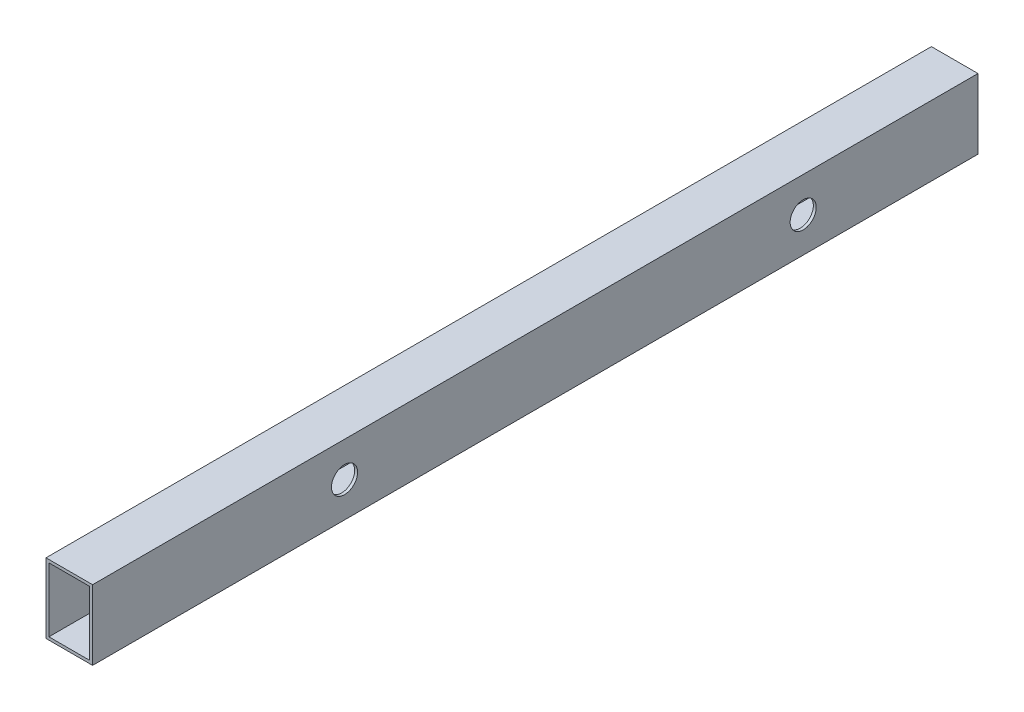
ISO-10303-21;
HEADER;
FILE_DESCRIPTION(('STEP AP214'),'2;1');
FILE_NAME('part.step','',(''),(''),'','','');
FILE_SCHEMA(('AUTOMOTIVE_DESIGN { 1 0 10303 214 1 1 1 1 }'));
ENDSEC;
DATA;
#1=APPLICATION_CONTEXT('core data for automotive mechanical design processes');
#2=APPLICATION_PROTOCOL_DEFINITION('international standard','automotive_design',2000,#1);
#3=PRODUCT_CONTEXT('',#1,'mechanical');
#4=PRODUCT('Part','Part','',(#3));
#5=PRODUCT_RELATED_PRODUCT_CATEGORY('part','',(#4));
#6=PRODUCT_DEFINITION_FORMATION('','',#4);
#7=PRODUCT_DEFINITION_CONTEXT('part definition',#1,'design');
#8=PRODUCT_DEFINITION('design','',#6,#7);
#9=PRODUCT_DEFINITION_SHAPE('','',#8);
#10=(LENGTH_UNIT() NAMED_UNIT(*) SI_UNIT(.MILLI.,.METRE.));
#11=(NAMED_UNIT(*) PLANE_ANGLE_UNIT() SI_UNIT($,.RADIAN.));
#12=(NAMED_UNIT(*) SI_UNIT($,.STERADIAN.) SOLID_ANGLE_UNIT());
#13=UNCERTAINTY_MEASURE_WITH_UNIT(LENGTH_MEASURE(1.E-05),#10,'distance_accuracy_value','');
#14=(GEOMETRIC_REPRESENTATION_CONTEXT(3) GLOBAL_UNCERTAINTY_ASSIGNED_CONTEXT((#13)) GLOBAL_UNIT_ASSIGNED_CONTEXT((#10,
#11,#12)) REPRESENTATION_CONTEXT('',''));
#15=CARTESIAN_POINT('',(0.,0.,0.));
#16=DIRECTION('',(0.,0.,1.));
#17=DIRECTION('',(1.,0.,0.));
#18=AXIS2_PLACEMENT_3D('',#15,#16,#17);
#19=CARTESIAN_POINT('',(0.,0.,965.2));
#20=DIRECTION('',(0.,0.,1.));
#21=DIRECTION('',(1.,0.,0.));
#22=AXIS2_PLACEMENT_3D('',#19,#20,#21);
#23=PLANE('',#22);
#24=DIRECTION('',(0.,1.,0.));
#25=VECTOR('',#24,1.);
#26=CARTESIAN_POINT('',(25.4,38.1,965.2));
#27=LINE('',#26,#25);
#28=CARTESIAN_POINT('',(25.4,-38.1,965.2));
#29=VERTEX_POINT('',#28);
#30=CARTESIAN_POINT('',(25.4,38.1,965.2));
#31=VERTEX_POINT('',#30);
#32=EDGE_CURVE('E156',#29,#31,#27,.T.);
#33=ORIENTED_EDGE('',*,*,#32,.T.);
#34=DIRECTION('',(-1.,0.,0.));
#35=VECTOR('',#34,1.);
#36=CARTESIAN_POINT('',(-25.4,38.1,965.2));
#37=LINE('',#36,#35);
#38=CARTESIAN_POINT('',(-25.4,38.1,965.2));
#39=VERTEX_POINT('',#38);
#40=EDGE_CURVE('E160',#31,#39,#37,.T.);
#41=ORIENTED_EDGE('',*,*,#40,.T.);
#42=DIRECTION('',(0.,-1.,0.));
#43=VECTOR('',#42,1.);
#44=CARTESIAN_POINT('',(-25.4,38.1,965.2));
#45=LINE('',#44,#43);
#46=CARTESIAN_POINT('',(-25.3999999999999,-38.1,965.2));
#47=VERTEX_POINT('',#46);
#48=EDGE_CURVE('E164',#39,#47,#45,.T.);
#49=ORIENTED_EDGE('',*,*,#48,.T.);
#50=DIRECTION('',(1.,0.,0.));
#51=VECTOR('',#50,1.);
#52=CARTESIAN_POINT('',(-25.3999999999999,-38.1,965.2));
#53=LINE('',#52,#51);
#54=EDGE_CURVE('E167',#47,#29,#53,.T.);
#55=ORIENTED_EDGE('',*,*,#54,.T.);
#56=EDGE_LOOP('',(#33,#41,#49,#55));
#57=FACE_BOUND('',#56,.T.);
#58=DIRECTION('',(1.,0.,0.));
#59=VECTOR('',#58,1.);
#60=CARTESIAN_POINT('',(-22.225,-34.925,965.2));
#61=LINE('',#60,#59);
#62=CARTESIAN_POINT('',(-22.225,-34.925,965.2));
#63=VERTEX_POINT('',#62);
#64=CARTESIAN_POINT('',(22.225,-34.925,965.2));
#65=VERTEX_POINT('',#64);
#66=EDGE_CURVE('E115',#63,#65,#61,.T.);
#67=ORIENTED_EDGE('',*,*,#66,.F.);
#68=DIRECTION('',(0.,-1.,0.));
#69=VECTOR('',#68,1.);
#70=CARTESIAN_POINT('',(-22.225,34.925,965.2));
#71=LINE('',#70,#69);
#72=CARTESIAN_POINT('',(-22.225,34.925,965.2));
#73=VERTEX_POINT('',#72);
#74=EDGE_CURVE('E106',#73,#63,#71,.T.);
#75=ORIENTED_EDGE('',*,*,#74,.F.);
#76=DIRECTION('',(-1.,0.,0.));
#77=VECTOR('',#76,1.);
#78=CARTESIAN_POINT('',(-22.225,34.925,965.2));
#79=LINE('',#78,#77);
#80=CARTESIAN_POINT('',(22.225,34.925,965.2));
#81=VERTEX_POINT('',#80);
#82=EDGE_CURVE('E132',#81,#73,#79,.T.);
#83=ORIENTED_EDGE('',*,*,#82,.F.);
#84=DIRECTION('',(0.,1.,0.));
#85=VECTOR('',#84,1.);
#86=CARTESIAN_POINT('',(22.225,34.925,965.2));
#87=LINE('',#86,#85);
#88=EDGE_CURVE('E128',#65,#81,#87,.T.);
#89=ORIENTED_EDGE('',*,*,#88,.F.);
#90=EDGE_LOOP('',(#67,#75,#83,#89));
#91=FACE_BOUND('',#90,.T.);
#92=ADVANCED_FACE('F38',(#57,#91),#23,.T.);
#93=CARTESIAN_POINT('',(0.,0.,0.));
#94=DIRECTION('',(0.,0.,1.));
#95=DIRECTION('',(1.,0.,0.));
#96=AXIS2_PLACEMENT_3D('',#93,#94,#95);
#97=PLANE('',#96);
#98=DIRECTION('',(0.,1.,0.));
#99=VECTOR('',#98,1.);
#100=CARTESIAN_POINT('',(25.4,38.1,0.));
#101=LINE('',#100,#99);
#102=CARTESIAN_POINT('',(25.4,-38.1,0.));
#103=VERTEX_POINT('',#102);
#104=CARTESIAN_POINT('',(25.4,38.1,0.));
#105=VERTEX_POINT('',#104);
#106=EDGE_CURVE('E124',#103,#105,#101,.T.);
#107=ORIENTED_EDGE('',*,*,#106,.F.);
#108=DIRECTION('',(1.,0.,0.));
#109=VECTOR('',#108,1.);
#110=CARTESIAN_POINT('',(-25.3999999999999,-38.1,0.));
#111=LINE('',#110,#109);
#112=CARTESIAN_POINT('',(-25.3999999999999,-38.1,0.));
#113=VERTEX_POINT('',#112);
#114=EDGE_CURVE('E161',#113,#103,#111,.T.);
#115=ORIENTED_EDGE('',*,*,#114,.F.);
#116=DIRECTION('',(0.,-1.,0.));
#117=VECTOR('',#116,1.);
#118=CARTESIAN_POINT('',(-25.4,38.1,0.));
#119=LINE('',#118,#117);
#120=CARTESIAN_POINT('',(-25.4,38.1,0.));
#121=VERTEX_POINT('',#120);
#122=EDGE_CURVE('E177',#121,#113,#119,.T.);
#123=ORIENTED_EDGE('',*,*,#122,.F.);
#124=DIRECTION('',(-1.,0.,0.));
#125=VECTOR('',#124,1.);
#126=CARTESIAN_POINT('',(-25.4,38.1,0.));
#127=LINE('',#126,#125);
#128=EDGE_CURVE('E174',#105,#121,#127,.T.);
#129=ORIENTED_EDGE('',*,*,#128,.F.);
#130=EDGE_LOOP('',(#107,#115,#123,#129));
#131=FACE_BOUND('',#130,.T.);
#132=DIRECTION('',(0.,-1.,0.));
#133=VECTOR('',#132,1.);
#134=CARTESIAN_POINT('',(-22.225,34.925,0.));
#135=LINE('',#134,#133);
#136=CARTESIAN_POINT('',(-22.225,34.925,0.));
#137=VERTEX_POINT('',#136);
#138=CARTESIAN_POINT('',(-22.225,-34.925,0.));
#139=VERTEX_POINT('',#138);
#140=EDGE_CURVE('E64',#137,#139,#135,.T.);
#141=ORIENTED_EDGE('',*,*,#140,.T.);
#142=DIRECTION('',(1.,0.,0.));
#143=VECTOR('',#142,1.);
#144=CARTESIAN_POINT('',(-22.225,-34.925,0.));
#145=LINE('',#144,#143);
#146=CARTESIAN_POINT('',(22.225,-34.925,0.));
#147=VERTEX_POINT('',#146);
#148=EDGE_CURVE('E122',#139,#147,#145,.T.);
#149=ORIENTED_EDGE('',*,*,#148,.T.);
#150=DIRECTION('',(0.,1.,0.));
#151=VECTOR('',#150,1.);
#152=CARTESIAN_POINT('',(22.225,34.925,0.));
#153=LINE('',#152,#151);
#154=CARTESIAN_POINT('',(22.225,34.925,0.));
#155=VERTEX_POINT('',#154);
#156=EDGE_CURVE('E143',#147,#155,#153,.T.);
#157=ORIENTED_EDGE('',*,*,#156,.T.);
#158=DIRECTION('',(-1.,0.,0.));
#159=VECTOR('',#158,1.);
#160=CARTESIAN_POINT('',(-22.225,34.925,0.));
#161=LINE('',#160,#159);
#162=EDGE_CURVE('E116',#155,#137,#161,.T.);
#163=ORIENTED_EDGE('',*,*,#162,.T.);
#164=EDGE_LOOP('',(#141,#149,#157,#163));
#165=FACE_BOUND('',#164,.T.);
#166=ADVANCED_FACE('F237',(#131,#165),#97,.F.);
#167=CARTESIAN_POINT('',(25.4,38.1,965.2));
#168=DIRECTION('',(-1.,0.,0.));
#169=DIRECTION('',(0.,-1.,0.));
#170=AXIS2_PLACEMENT_3D('',#167,#168,#169);
#171=PLANE('',#170);
#172=CARTESIAN_POINT('',(25.4,0.,190.549048410685));
#173=DIRECTION('',(1.,0.,0.));
#174=DIRECTION('',(0.,1.,0.));
#175=AXIS2_PLACEMENT_3D('',#172,#173,#174);
#176=CIRCLE('',#175,14.224);
#177=CARTESIAN_POINT('',(25.4,14.224,190.549048410685));
#178=VERTEX_POINT('',#177);
#179=EDGE_CURVE('E203',#178,#178,#176,.T.);
#180=ORIENTED_EDGE('',*,*,#179,.F.);
#181=EDGE_LOOP('',(#180));
#182=FACE_BOUND('',#181,.T.);
#183=CARTESIAN_POINT('',(25.4,0.,690.548048410685));
#184=DIRECTION('',(1.,0.,0.));
#185=DIRECTION('',(0.,1.,0.));
#186=AXIS2_PLACEMENT_3D('',#183,#184,#185);
#187=CIRCLE('',#186,14.2240000000001);
#188=CARTESIAN_POINT('',(25.4,14.224,690.548048410685));
#189=VERTEX_POINT('',#188);
#190=EDGE_CURVE('E209',#189,#189,#187,.T.);
#191=ORIENTED_EDGE('',*,*,#190,.F.);
#192=EDGE_LOOP('',(#191));
#193=FACE_BOUND('',#192,.T.);
#194=ORIENTED_EDGE('',*,*,#106,.T.);
#195=DIRECTION('',(0.,0.,-1.));
#196=VECTOR('',#195,1.);
#197=CARTESIAN_POINT('',(25.4,38.1,965.2));
#198=LINE('',#197,#196);
#199=EDGE_CURVE('E11',#31,#105,#198,.T.);
#200=ORIENTED_EDGE('',*,*,#199,.F.);
#201=ORIENTED_EDGE('',*,*,#32,.F.);
#202=DIRECTION('',(0.,0.,-1.));
#203=VECTOR('',#202,1.);
#204=CARTESIAN_POINT('',(25.4,-38.1,965.2));
#205=LINE('',#204,#203);
#206=EDGE_CURVE('E170',#29,#103,#205,.T.);
#207=ORIENTED_EDGE('',*,*,#206,.T.);
#208=EDGE_LOOP('',(#194,#200,#201,#207));
#209=FACE_BOUND('',#208,.T.);
#210=ADVANCED_FACE('F40',(#182,#193,#209),#171,.F.);
#211=CARTESIAN_POINT('',(-25.4,38.1,965.2));
#212=DIRECTION('',(0.,-1.,0.));
#213=DIRECTION('',(0.,0.,-1.));
#214=AXIS2_PLACEMENT_3D('',#211,#212,#213);
#215=PLANE('',#214);
#216=ORIENTED_EDGE('',*,*,#128,.T.);
#217=DIRECTION('',(0.,0.,-1.));
#218=VECTOR('',#217,1.);
#219=CARTESIAN_POINT('',(-25.4,38.1,965.2));
#220=LINE('',#219,#218);
#221=EDGE_CURVE('E48',#39,#121,#220,.T.);
#222=ORIENTED_EDGE('',*,*,#221,.F.);
#223=ORIENTED_EDGE('',*,*,#40,.F.);
#224=ORIENTED_EDGE('',*,*,#199,.T.);
#225=EDGE_LOOP('',(#216,#222,#223,#224));
#226=FACE_BOUND('',#225,.T.);
#227=ADVANCED_FACE('F264',(#226),#215,.F.);
#228=CARTESIAN_POINT('',(-25.4,38.1,965.2));
#229=DIRECTION('',(1.,0.,0.));
#230=DIRECTION('',(0.,1.,0.));
#231=AXIS2_PLACEMENT_3D('',#228,#229,#230);
#232=PLANE('',#231);
#233=CARTESIAN_POINT('',(-25.4,0.,190.549048410685));
#234=DIRECTION('',(1.,0.,0.));
#235=DIRECTION('',(0.,1.,0.));
#236=AXIS2_PLACEMENT_3D('',#233,#234,#235);
#237=CIRCLE('',#236,14.224);
#238=CARTESIAN_POINT('',(-25.4,14.224,190.549048410685));
#239=VERTEX_POINT('',#238);
#240=EDGE_CURVE('E195',#239,#239,#237,.F.);
#241=ORIENTED_EDGE('',*,*,#240,.F.);
#242=EDGE_LOOP('',(#241));
#243=FACE_BOUND('',#242,.T.);
#244=CARTESIAN_POINT('',(-25.4,0.,690.548048410685));
#245=DIRECTION('',(1.,0.,0.));
#246=DIRECTION('',(0.,1.,0.));
#247=AXIS2_PLACEMENT_3D('',#244,#245,#246);
#248=CIRCLE('',#247,14.2240000000001);
#249=CARTESIAN_POINT('',(-25.4,14.224,690.548048410685));
#250=VERTEX_POINT('',#249);
#251=EDGE_CURVE('E212',#250,#250,#248,.F.);
#252=ORIENTED_EDGE('',*,*,#251,.F.);
#253=EDGE_LOOP('',(#252));
#254=FACE_BOUND('',#253,.T.);
#255=ORIENTED_EDGE('',*,*,#122,.T.);
#256=DIRECTION('',(0.,0.,-1.));
#257=VECTOR('',#256,1.);
#258=CARTESIAN_POINT('',(-25.3999999999999,-38.1,965.2));
#259=LINE('',#258,#257);
#260=EDGE_CURVE('E185',#47,#113,#259,.T.);
#261=ORIENTED_EDGE('',*,*,#260,.F.);
#262=ORIENTED_EDGE('',*,*,#48,.F.);
#263=ORIENTED_EDGE('',*,*,#221,.T.);
#264=EDGE_LOOP('',(#255,#261,#262,#263));
#265=FACE_BOUND('',#264,.T.);
#266=ADVANCED_FACE('F261',(#243,#254,#265),#232,.F.);
#267=CARTESIAN_POINT('',(-25.3999999999999,-38.1,965.2));
#268=DIRECTION('',(0.,1.,0.));
#269=DIRECTION('',(0.,0.,1.));
#270=AXIS2_PLACEMENT_3D('',#267,#268,#269);
#271=PLANE('',#270);
#272=ORIENTED_EDGE('',*,*,#114,.T.);
#273=ORIENTED_EDGE('',*,*,#206,.F.);
#274=ORIENTED_EDGE('',*,*,#54,.F.);
#275=ORIENTED_EDGE('',*,*,#260,.T.);
#276=EDGE_LOOP('',(#272,#273,#274,#275));
#277=FACE_BOUND('',#276,.T.);
#278=ADVANCED_FACE('F258',(#277),#271,.F.);
#279=CARTESIAN_POINT('',(-22.225,34.925,965.2));
#280=DIRECTION('',(1.,0.,0.));
#281=DIRECTION('',(0.,1.,0.));
#282=AXIS2_PLACEMENT_3D('',#279,#280,#281);
#283=PLANE('',#282);
#284=CARTESIAN_POINT('',(-22.225,0.,190.549048410685));
#285=DIRECTION('',(1.,0.,0.));
#286=DIRECTION('',(0.,1.,0.));
#287=AXIS2_PLACEMENT_3D('',#284,#285,#286);
#288=CIRCLE('',#287,14.224);
#289=CARTESIAN_POINT('',(-22.225,14.224,190.549048410685));
#290=VERTEX_POINT('',#289);
#291=EDGE_CURVE('E140',#290,#290,#288,.T.);
#292=ORIENTED_EDGE('',*,*,#291,.F.);
#293=EDGE_LOOP('',(#292));
#294=FACE_BOUND('',#293,.T.);
#295=CARTESIAN_POINT('',(-22.225,0.,690.548048410685));
#296=DIRECTION('',(1.,0.,0.));
#297=DIRECTION('',(0.,1.,0.));
#298=AXIS2_PLACEMENT_3D('',#295,#296,#297);
#299=CIRCLE('',#298,14.2240000000001);
#300=CARTESIAN_POINT('',(-22.225,14.224,690.548048410685));
#301=VERTEX_POINT('',#300);
#302=EDGE_CURVE('E194',#301,#301,#299,.T.);
#303=ORIENTED_EDGE('',*,*,#302,.F.);
#304=EDGE_LOOP('',(#303));
#305=FACE_BOUND('',#304,.T.);
#306=ORIENTED_EDGE('',*,*,#140,.F.);
#307=DIRECTION('',(0.,0.,-1.));
#308=VECTOR('',#307,1.);
#309=CARTESIAN_POINT('',(-22.225,34.925,965.2));
#310=LINE('',#309,#308);
#311=EDGE_CURVE('E110',#73,#137,#310,.T.);
#312=ORIENTED_EDGE('',*,*,#311,.F.);
#313=ORIENTED_EDGE('',*,*,#74,.T.);
#314=DIRECTION('',(0.,0.,-1.));
#315=VECTOR('',#314,1.);
#316=CARTESIAN_POINT('',(-22.225,-34.925,965.2));
#317=LINE('',#316,#315);
#318=EDGE_CURVE('E109',#63,#139,#317,.T.);
#319=ORIENTED_EDGE('',*,*,#318,.T.);
#320=EDGE_LOOP('',(#306,#312,#313,#319));
#321=FACE_BOUND('',#320,.T.);
#322=ADVANCED_FACE('F108',(#294,#305,#321),#283,.T.);
#323=CARTESIAN_POINT('',(-22.225,-34.925,965.2));
#324=DIRECTION('',(0.,1.,0.));
#325=DIRECTION('',(-1.,0.,0.));
#326=AXIS2_PLACEMENT_3D('',#323,#324,#325);
#327=PLANE('',#326);
#328=ORIENTED_EDGE('',*,*,#148,.F.);
#329=ORIENTED_EDGE('',*,*,#318,.F.);
#330=ORIENTED_EDGE('',*,*,#66,.T.);
#331=DIRECTION('',(0.,0.,-1.));
#332=VECTOR('',#331,1.);
#333=CARTESIAN_POINT('',(22.225,-34.925,965.2));
#334=LINE('',#333,#332);
#335=EDGE_CURVE('E125',#65,#147,#334,.T.);
#336=ORIENTED_EDGE('',*,*,#335,.T.);
#337=EDGE_LOOP('',(#328,#329,#330,#336));
#338=FACE_BOUND('',#337,.T.);
#339=ADVANCED_FACE('F119',(#338),#327,.T.);
#340=CARTESIAN_POINT('',(22.225,34.925,965.2));
#341=DIRECTION('',(-1.,0.,0.));
#342=DIRECTION('',(0.,-1.,0.));
#343=AXIS2_PLACEMENT_3D('',#340,#341,#342);
#344=PLANE('',#343);
#345=CARTESIAN_POINT('',(22.225,0.,190.549048410685));
#346=DIRECTION('',(-1.,0.,0.));
#347=DIRECTION('',(0.,-1.,0.));
#348=AXIS2_PLACEMENT_3D('',#345,#346,#347);
#349=CIRCLE('',#348,14.224);
#350=CARTESIAN_POINT('',(22.225,-14.224,190.549048410685));
#351=VERTEX_POINT('',#350);
#352=EDGE_CURVE('E42',#351,#351,#349,.T.);
#353=ORIENTED_EDGE('',*,*,#352,.F.);
#354=EDGE_LOOP('',(#353));
#355=FACE_BOUND('',#354,.T.);
#356=CARTESIAN_POINT('',(22.225,0.,690.548048410685));
#357=DIRECTION('',(-1.,0.,0.));
#358=DIRECTION('',(0.,-1.,0.));
#359=AXIS2_PLACEMENT_3D('',#356,#357,#358);
#360=CIRCLE('',#359,14.2240000000001);
#361=CARTESIAN_POINT('',(22.225,-14.2240000000001,690.548048410685));
#362=VERTEX_POINT('',#361);
#363=EDGE_CURVE('E191',#362,#362,#360,.T.);
#364=ORIENTED_EDGE('',*,*,#363,.F.);
#365=EDGE_LOOP('',(#364));
#366=FACE_BOUND('',#365,.T.);
#367=ORIENTED_EDGE('',*,*,#156,.F.);
#368=ORIENTED_EDGE('',*,*,#335,.F.);
#369=ORIENTED_EDGE('',*,*,#88,.T.);
#370=DIRECTION('',(0.,0.,-1.));
#371=VECTOR('',#370,1.);
#372=CARTESIAN_POINT('',(22.225,34.925,965.2));
#373=LINE('',#372,#371);
#374=EDGE_CURVE('E56',#81,#155,#373,.T.);
#375=ORIENTED_EDGE('',*,*,#374,.T.);
#376=EDGE_LOOP('',(#367,#368,#369,#375));
#377=FACE_BOUND('',#376,.T.);
#378=ADVANCED_FACE('F229',(#355,#366,#377),#344,.T.);
#379=CARTESIAN_POINT('',(-22.225,34.925,965.2));
#380=DIRECTION('',(0.,-1.,0.));
#381=DIRECTION('',(1.,0.,0.));
#382=AXIS2_PLACEMENT_3D('',#379,#380,#381);
#383=PLANE('',#382);
#384=ORIENTED_EDGE('',*,*,#162,.F.);
#385=ORIENTED_EDGE('',*,*,#374,.F.);
#386=ORIENTED_EDGE('',*,*,#82,.T.);
#387=ORIENTED_EDGE('',*,*,#311,.T.);
#388=EDGE_LOOP('',(#384,#385,#386,#387));
#389=FACE_BOUND('',#388,.T.);
#390=ADVANCED_FACE('F232',(#389),#383,.T.);
#391=CARTESIAN_POINT('',(-65.6315474223899,0.,690.548048410685));
#392=DIRECTION('',(1.,0.,0.));
#393=DIRECTION('',(0.,1.,0.));
#394=AXIS2_PLACEMENT_3D('',#391,#392,#393);
#395=CYLINDRICAL_SURFACE('',#394,14.2240000000001);
#396=ORIENTED_EDGE('',*,*,#363,.T.);
#397=EDGE_LOOP('',(#396));
#398=FACE_BOUND('',#397,.T.);
#399=ORIENTED_EDGE('',*,*,#190,.T.);
#400=EDGE_LOOP('',(#399));
#401=FACE_BOUND('',#400,.T.);
#402=ADVANCED_FACE('F239',(#398,#401),#395,.F.);
#403=CARTESIAN_POINT('',(-65.6315474223899,0.,190.549048410685));
#404=DIRECTION('',(1.,0.,0.));
#405=DIRECTION('',(0.,1.,0.));
#406=AXIS2_PLACEMENT_3D('',#403,#404,#405);
#407=CYLINDRICAL_SURFACE('',#406,14.224);
#408=ORIENTED_EDGE('',*,*,#352,.T.);
#409=EDGE_LOOP('',(#408));
#410=FACE_BOUND('',#409,.T.);
#411=ORIENTED_EDGE('',*,*,#179,.T.);
#412=EDGE_LOOP('',(#411));
#413=FACE_BOUND('',#412,.T.);
#414=ADVANCED_FACE('F226',(#410,#413),#407,.F.);
#415=ORIENTED_EDGE('',*,*,#302,.T.);
#416=EDGE_LOOP('',(#415));
#417=FACE_BOUND('',#416,.T.);
#418=ORIENTED_EDGE('',*,*,#251,.T.);
#419=EDGE_LOOP('',(#418));
#420=FACE_BOUND('',#419,.T.);
#421=ADVANCED_FACE('F246',(#417,#420),#395,.F.);
#422=ORIENTED_EDGE('',*,*,#291,.T.);
#423=EDGE_LOOP('',(#422));
#424=FACE_BOUND('',#423,.T.);
#425=ORIENTED_EDGE('',*,*,#240,.T.);
#426=EDGE_LOOP('',(#425));
#427=FACE_BOUND('',#426,.T.);
#428=ADVANCED_FACE('F293',(#424,#427),#407,.F.);
#429=CLOSED_SHELL('',(#92,#166,#210,#227,#266,#278,#322,#339,#378,#390,#402,#414,#421,#428));
#430=MANIFOLD_SOLID_BREP('B2',#429);
#431=ADVANCED_BREP_SHAPE_REPRESENTATION('',(#18,#430),#14);
#432=SHAPE_DEFINITION_REPRESENTATION(#9,#431);
ENDSEC;
END-ISO-10303-21;
